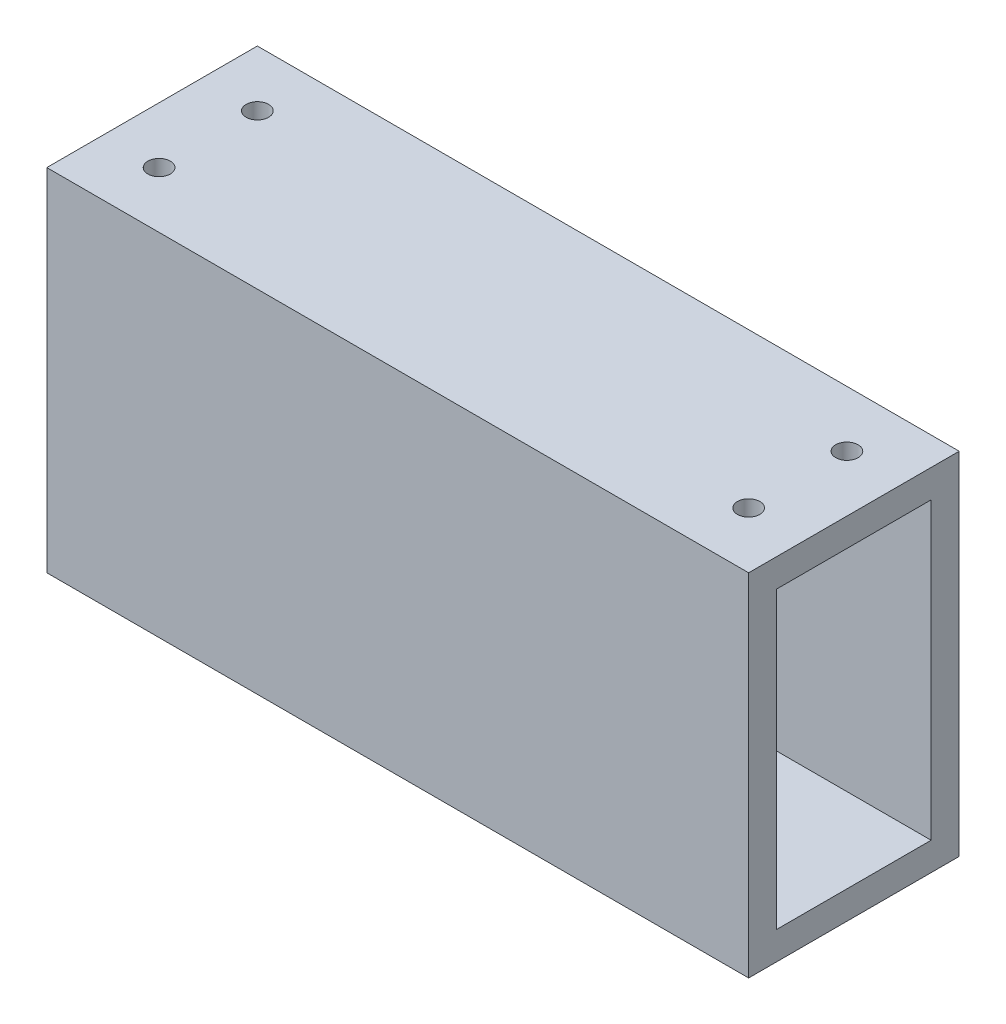
ISO-10303-21;
HEADER;
FILE_DESCRIPTION(('STEP AP214'),'2;1');
FILE_NAME('part.step','',(''),(''),'','','');
FILE_SCHEMA(('AUTOMOTIVE_DESIGN { 1 0 10303 214 1 1 1 1 }'));
ENDSEC;
DATA;
#1=APPLICATION_CONTEXT('core data for automotive mechanical design processes');
#2=APPLICATION_PROTOCOL_DEFINITION('international standard','automotive_design',2000,#1);
#3=PRODUCT_CONTEXT('',#1,'mechanical');
#4=PRODUCT('Part','Part','',(#3));
#5=PRODUCT_RELATED_PRODUCT_CATEGORY('part','',(#4));
#6=PRODUCT_DEFINITION_FORMATION('','',#4);
#7=PRODUCT_DEFINITION_CONTEXT('part definition',#1,'design');
#8=PRODUCT_DEFINITION('design','',#6,#7);
#9=PRODUCT_DEFINITION_SHAPE('','',#8);
#10=(LENGTH_UNIT() NAMED_UNIT(*) SI_UNIT(.MILLI.,.METRE.));
#11=(NAMED_UNIT(*) PLANE_ANGLE_UNIT() SI_UNIT($,.RADIAN.));
#12=(NAMED_UNIT(*) SI_UNIT($,.STERADIAN.) SOLID_ANGLE_UNIT());
#13=UNCERTAINTY_MEASURE_WITH_UNIT(LENGTH_MEASURE(1.E-05),#10,'distance_accuracy_value','');
#14=(GEOMETRIC_REPRESENTATION_CONTEXT(3) GLOBAL_UNCERTAINTY_ASSIGNED_CONTEXT((#13)) GLOBAL_UNIT_ASSIGNED_CONTEXT((#10,
#11,#12)) REPRESENTATION_CONTEXT('',''));
#15=CARTESIAN_POINT('',(0.,0.,0.));
#16=DIRECTION('',(0.,0.,1.));
#17=DIRECTION('',(1.,0.,0.));
#18=AXIS2_PLACEMENT_3D('',#15,#16,#17);
#19=CARTESIAN_POINT('',(50.,50.,-15.));
#20=DIRECTION('',(-1.,0.,0.));
#21=DIRECTION('',(0.,0.,1.));
#22=AXIS2_PLACEMENT_3D('',#19,#20,#21);
#23=PLANE('',#22);
#24=DIRECTION('',(0.,0.,-1.));
#25=VECTOR('',#24,1.);
#26=CARTESIAN_POINT('',(50.,46.,11.));
#27=LINE('',#26,#25);
#28=CARTESIAN_POINT('',(50.,46.,11.));
#29=VERTEX_POINT('',#28);
#30=CARTESIAN_POINT('',(50.,46.,-11.));
#31=VERTEX_POINT('',#30);
#32=EDGE_CURVE('E121',#29,#31,#27,.T.);
#33=ORIENTED_EDGE('',*,*,#32,.T.);
#34=DIRECTION('',(0.,-1.,0.));
#35=VECTOR('',#34,1.);
#36=CARTESIAN_POINT('',(50.,46.,-11.));
#37=LINE('',#36,#35);
#38=CARTESIAN_POINT('',(50.,4.,-11.));
#39=VERTEX_POINT('',#38);
#40=EDGE_CURVE('E114',#31,#39,#37,.T.);
#41=ORIENTED_EDGE('',*,*,#40,.T.);
#42=DIRECTION('',(0.,0.,1.));
#43=VECTOR('',#42,1.);
#44=CARTESIAN_POINT('',(50.,4.,-11.));
#45=LINE('',#44,#43);
#46=CARTESIAN_POINT('',(50.,4.00000000000001,11.));
#47=VERTEX_POINT('',#46);
#48=EDGE_CURVE('E124',#39,#47,#45,.T.);
#49=ORIENTED_EDGE('',*,*,#48,.T.);
#50=DIRECTION('',(0.,1.,0.));
#51=VECTOR('',#50,1.);
#52=CARTESIAN_POINT('',(50.,4.,11.));
#53=LINE('',#52,#51);
#54=EDGE_CURVE('E62',#47,#29,#53,.T.);
#55=ORIENTED_EDGE('',*,*,#54,.T.);
#56=EDGE_LOOP('',(#33,#41,#49,#55));
#57=FACE_BOUND('',#56,.T.);
#58=DIRECTION('',(0.,0.,-1.));
#59=VECTOR('',#58,1.);
#60=CARTESIAN_POINT('',(50.,0.,-15.));
#61=LINE('',#60,#59);
#62=CARTESIAN_POINT('',(50.,0.,15.));
#63=VERTEX_POINT('',#62);
#64=CARTESIAN_POINT('',(50.,0.,-15.));
#65=VERTEX_POINT('',#64);
#66=EDGE_CURVE('E158',#63,#65,#61,.T.);
#67=ORIENTED_EDGE('',*,*,#66,.T.);
#68=DIRECTION('',(0.,-1.,0.));
#69=VECTOR('',#68,1.);
#70=CARTESIAN_POINT('',(50.,50.,-15.));
#71=LINE('',#70,#69);
#72=CARTESIAN_POINT('',(50.,50.,-15.));
#73=VERTEX_POINT('',#72);
#74=EDGE_CURVE('E11',#73,#65,#71,.T.);
#75=ORIENTED_EDGE('',*,*,#74,.F.);
#76=DIRECTION('',(0.,0.,-1.));
#77=VECTOR('',#76,1.);
#78=CARTESIAN_POINT('',(50.,50.,-15.));
#79=LINE('',#78,#77);
#80=CARTESIAN_POINT('',(50.,50.,15.));
#81=VERTEX_POINT('',#80);
#82=EDGE_CURVE('E164',#81,#73,#79,.T.);
#83=ORIENTED_EDGE('',*,*,#82,.F.);
#84=DIRECTION('',(0.,-1.,0.));
#85=VECTOR('',#84,1.);
#86=CARTESIAN_POINT('',(50.,50.,15.));
#87=LINE('',#86,#85);
#88=EDGE_CURVE('E178',#81,#63,#87,.T.);
#89=ORIENTED_EDGE('',*,*,#88,.T.);
#90=EDGE_LOOP('',(#67,#75,#83,#89));
#91=FACE_BOUND('',#90,.T.);
#92=ADVANCED_FACE('F45',(#57,#91),#23,.F.);
#93=CARTESIAN_POINT('',(-50.,50.,-15.));
#94=DIRECTION('',(0.,0.,1.));
#95=DIRECTION('',(1.,0.,0.));
#96=AXIS2_PLACEMENT_3D('',#93,#94,#95);
#97=PLANE('',#96);
#98=DIRECTION('',(-1.,0.,0.));
#99=VECTOR('',#98,1.);
#100=CARTESIAN_POINT('',(-50.,0.,-15.));
#101=LINE('',#100,#99);
#102=CARTESIAN_POINT('',(-50.,0.,-15.));
#103=VERTEX_POINT('',#102);
#104=EDGE_CURVE('E182',#65,#103,#101,.T.);
#105=ORIENTED_EDGE('',*,*,#104,.T.);
#106=DIRECTION('',(0.,-1.,0.));
#107=VECTOR('',#106,1.);
#108=CARTESIAN_POINT('',(-50.,50.,-15.));
#109=LINE('',#108,#107);
#110=CARTESIAN_POINT('',(-50.,50.,-15.));
#111=VERTEX_POINT('',#110);
#112=EDGE_CURVE('E54',#111,#103,#109,.T.);
#113=ORIENTED_EDGE('',*,*,#112,.F.);
#114=DIRECTION('',(-1.,0.,0.));
#115=VECTOR('',#114,1.);
#116=CARTESIAN_POINT('',(-50.,50.,-15.));
#117=LINE('',#116,#115);
#118=EDGE_CURVE('E168',#73,#111,#117,.T.);
#119=ORIENTED_EDGE('',*,*,#118,.F.);
#120=ORIENTED_EDGE('',*,*,#74,.T.);
#121=EDGE_LOOP('',(#105,#113,#119,#120));
#122=FACE_BOUND('',#121,.T.);
#123=ADVANCED_FACE('F269',(#122),#97,.F.);
#124=CARTESIAN_POINT('',(-50.,50.,-15.));
#125=DIRECTION('',(1.,0.,0.));
#126=DIRECTION('',(0.,0.,-1.));
#127=AXIS2_PLACEMENT_3D('',#124,#125,#126);
#128=PLANE('',#127);
#129=DIRECTION('',(0.,0.,1.));
#130=VECTOR('',#129,1.);
#131=CARTESIAN_POINT('',(-50.,4.,-11.));
#132=LINE('',#131,#130);
#133=CARTESIAN_POINT('',(-50.,4.,-11.));
#134=VERTEX_POINT('',#133);
#135=CARTESIAN_POINT('',(-50.,4.,11.));
#136=VERTEX_POINT('',#135);
#137=EDGE_CURVE('E148',#134,#136,#132,.T.);
#138=ORIENTED_EDGE('',*,*,#137,.F.);
#139=DIRECTION('',(0.,-1.,0.));
#140=VECTOR('',#139,1.);
#141=CARTESIAN_POINT('',(-50.,46.,-11.));
#142=LINE('',#141,#140);
#143=CARTESIAN_POINT('',(-50.,46.,-11.));
#144=VERTEX_POINT('',#143);
#145=EDGE_CURVE('E70',#144,#134,#142,.T.);
#146=ORIENTED_EDGE('',*,*,#145,.F.);
#147=DIRECTION('',(0.,0.,-1.));
#148=VECTOR('',#147,1.);
#149=CARTESIAN_POINT('',(-50.,46.,11.));
#150=LINE('',#149,#148);
#151=CARTESIAN_POINT('',(-50.,46.,11.));
#152=VERTEX_POINT('',#151);
#153=EDGE_CURVE('E132',#152,#144,#150,.T.);
#154=ORIENTED_EDGE('',*,*,#153,.F.);
#155=DIRECTION('',(0.,1.,0.));
#156=VECTOR('',#155,1.);
#157=CARTESIAN_POINT('',(-50.,4.,11.));
#158=LINE('',#157,#156);
#159=EDGE_CURVE('E136',#136,#152,#158,.T.);
#160=ORIENTED_EDGE('',*,*,#159,.F.);
#161=EDGE_LOOP('',(#138,#146,#154,#160));
#162=FACE_BOUND('',#161,.T.);
#163=DIRECTION('',(0.,0.,1.));
#164=VECTOR('',#163,1.);
#165=CARTESIAN_POINT('',(-50.,0.,-15.));
#166=LINE('',#165,#164);
#167=CARTESIAN_POINT('',(-50.,0.,15.));
#168=VERTEX_POINT('',#167);
#169=EDGE_CURVE('E185',#103,#168,#166,.T.);
#170=ORIENTED_EDGE('',*,*,#169,.T.);
#171=DIRECTION('',(0.,-1.,0.));
#172=VECTOR('',#171,1.);
#173=CARTESIAN_POINT('',(-50.,50.,15.));
#174=LINE('',#173,#172);
#175=CARTESIAN_POINT('',(-50.,50.,15.));
#176=VERTEX_POINT('',#175);
#177=EDGE_CURVE('E193',#176,#168,#174,.T.);
#178=ORIENTED_EDGE('',*,*,#177,.F.);
#179=DIRECTION('',(0.,0.,1.));
#180=VECTOR('',#179,1.);
#181=CARTESIAN_POINT('',(-50.,50.,-15.));
#182=LINE('',#181,#180);
#183=EDGE_CURVE('E172',#111,#176,#182,.T.);
#184=ORIENTED_EDGE('',*,*,#183,.F.);
#185=ORIENTED_EDGE('',*,*,#112,.T.);
#186=EDGE_LOOP('',(#170,#178,#184,#185));
#187=FACE_BOUND('',#186,.T.);
#188=ADVANCED_FACE('F274',(#162,#187),#128,.F.);
#189=CARTESIAN_POINT('',(-50.,50.,15.));
#190=DIRECTION('',(0.,0.,-1.));
#191=DIRECTION('',(-1.,0.,0.));
#192=AXIS2_PLACEMENT_3D('',#189,#190,#191);
#193=PLANE('',#192);
#194=DIRECTION('',(1.,0.,0.));
#195=VECTOR('',#194,1.);
#196=CARTESIAN_POINT('',(-50.,0.,15.));
#197=LINE('',#196,#195);
#198=EDGE_CURVE('E169',#168,#63,#197,.T.);
#199=ORIENTED_EDGE('',*,*,#198,.T.);
#200=ORIENTED_EDGE('',*,*,#88,.F.);
#201=DIRECTION('',(1.,0.,0.));
#202=VECTOR('',#201,1.);
#203=CARTESIAN_POINT('',(-50.,50.,15.));
#204=LINE('',#203,#202);
#205=EDGE_CURVE('E175',#176,#81,#204,.T.);
#206=ORIENTED_EDGE('',*,*,#205,.F.);
#207=ORIENTED_EDGE('',*,*,#177,.T.);
#208=EDGE_LOOP('',(#199,#200,#206,#207));
#209=FACE_BOUND('',#208,.T.);
#210=ADVANCED_FACE('F257',(#209),#193,.F.);
#211=CARTESIAN_POINT('',(0.,50.,0.));
#212=DIRECTION('',(0.,1.,0.));
#213=DIRECTION('',(0.,0.,1.));
#214=AXIS2_PLACEMENT_3D('',#211,#212,#213);
#215=PLANE('',#214);
#216=CARTESIAN_POINT('',(-42.,50.,7.));
#217=DIRECTION('',(0.,1.,0.));
#218=DIRECTION('',(0.,0.,1.));
#219=AXIS2_PLACEMENT_3D('',#216,#217,#218);
#220=CIRCLE('',#219,1.6);
#221=CARTESIAN_POINT('',(-42.,50.,8.6));
#222=VERTEX_POINT('',#221);
#223=EDGE_CURVE('E237',#222,#222,#220,.T.);
#224=ORIENTED_EDGE('',*,*,#223,.F.);
#225=EDGE_LOOP('',(#224));
#226=FACE_BOUND('',#225,.T.);
#227=CARTESIAN_POINT('',(42.,50.,-7.));
#228=DIRECTION('',(0.,1.,0.));
#229=DIRECTION('',(0.,0.,1.));
#230=AXIS2_PLACEMENT_3D('',#227,#228,#229);
#231=CIRCLE('',#230,1.6);
#232=CARTESIAN_POINT('',(42.,50.,-5.4));
#233=VERTEX_POINT('',#232);
#234=EDGE_CURVE('E238',#233,#233,#231,.T.);
#235=ORIENTED_EDGE('',*,*,#234,.F.);
#236=EDGE_LOOP('',(#235));
#237=FACE_BOUND('',#236,.T.);
#238=CARTESIAN_POINT('',(42.,50.,7.));
#239=DIRECTION('',(0.,1.,0.));
#240=DIRECTION('',(0.,0.,1.));
#241=AXIS2_PLACEMENT_3D('',#238,#239,#240);
#242=CIRCLE('',#241,1.6);
#243=CARTESIAN_POINT('',(42.,50.,8.6));
#244=VERTEX_POINT('',#243);
#245=EDGE_CURVE('E242',#244,#244,#242,.T.);
#246=ORIENTED_EDGE('',*,*,#245,.F.);
#247=EDGE_LOOP('',(#246));
#248=FACE_BOUND('',#247,.T.);
#249=CARTESIAN_POINT('',(-42.,50.,-7.));
#250=DIRECTION('',(0.,1.,0.));
#251=DIRECTION('',(0.,0.,1.));
#252=AXIS2_PLACEMENT_3D('',#249,#250,#251);
#253=CIRCLE('',#252,1.6);
#254=CARTESIAN_POINT('',(-42.,50.,-5.4));
#255=VERTEX_POINT('',#254);
#256=EDGE_CURVE('E213',#255,#255,#253,.T.);
#257=ORIENTED_EDGE('',*,*,#256,.F.);
#258=EDGE_LOOP('',(#257));
#259=FACE_BOUND('',#258,.T.);
#260=ORIENTED_EDGE('',*,*,#82,.T.);
#261=ORIENTED_EDGE('',*,*,#118,.T.);
#262=ORIENTED_EDGE('',*,*,#183,.T.);
#263=ORIENTED_EDGE('',*,*,#205,.T.);
#264=EDGE_LOOP('',(#260,#261,#262,#263));
#265=FACE_BOUND('',#264,.T.);
#266=ADVANCED_FACE('F253',(#226,#237,#248,#259,#265),#215,.T.);
#267=CARTESIAN_POINT('',(0.,0.,0.));
#268=DIRECTION('',(0.,1.,0.));
#269=DIRECTION('',(0.,0.,1.));
#270=AXIS2_PLACEMENT_3D('',#267,#268,#269);
#271=PLANE('',#270);
#272=CARTESIAN_POINT('',(13.,0.,8.));
#273=DIRECTION('',(0.,-1.,0.));
#274=DIRECTION('',(0.,0.,-1.));
#275=AXIS2_PLACEMENT_3D('',#272,#273,#274);
#276=CIRCLE('',#275,2.1);
#277=CARTESIAN_POINT('',(13.,0.,5.9));
#278=VERTEX_POINT('',#277);
#279=EDGE_CURVE('E204',#278,#278,#276,.T.);
#280=ORIENTED_EDGE('',*,*,#279,.F.);
#281=EDGE_LOOP('',(#280));
#282=FACE_BOUND('',#281,.T.);
#283=CARTESIAN_POINT('',(-13.,0.,8.));
#284=DIRECTION('',(0.,-1.,0.));
#285=DIRECTION('',(0.,0.,1.));
#286=AXIS2_PLACEMENT_3D('',#283,#284,#285);
#287=CIRCLE('',#286,2.1);
#288=CARTESIAN_POINT('',(-13.,0.,10.1));
#289=VERTEX_POINT('',#288);
#290=EDGE_CURVE('E139',#289,#289,#287,.T.);
#291=ORIENTED_EDGE('',*,*,#290,.F.);
#292=EDGE_LOOP('',(#291));
#293=FACE_BOUND('',#292,.T.);
#294=ORIENTED_EDGE('',*,*,#66,.F.);
#295=ORIENTED_EDGE('',*,*,#198,.F.);
#296=ORIENTED_EDGE('',*,*,#169,.F.);
#297=ORIENTED_EDGE('',*,*,#104,.F.);
#298=EDGE_LOOP('',(#294,#295,#296,#297));
#299=FACE_BOUND('',#298,.T.);
#300=ADVANCED_FACE('F256',(#282,#293,#299),#271,.F.);
#301=CARTESIAN_POINT('',(50.,46.,-11.));
#302=DIRECTION('',(0.,0.,-1.));
#303=DIRECTION('',(-1.,0.,0.));
#304=AXIS2_PLACEMENT_3D('',#301,#302,#303);
#305=PLANE('',#304);
#306=ORIENTED_EDGE('',*,*,#145,.T.);
#307=DIRECTION('',(-1.,0.,0.));
#308=VECTOR('',#307,1.);
#309=CARTESIAN_POINT('',(50.,4.,-11.));
#310=LINE('',#309,#308);
#311=EDGE_CURVE('E110',#39,#134,#310,.T.);
#312=ORIENTED_EDGE('',*,*,#311,.F.);
#313=ORIENTED_EDGE('',*,*,#40,.F.);
#314=DIRECTION('',(-1.,0.,0.));
#315=VECTOR('',#314,1.);
#316=CARTESIAN_POINT('',(50.,46.,-11.));
#317=LINE('',#316,#315);
#318=EDGE_CURVE('E155',#31,#144,#317,.T.);
#319=ORIENTED_EDGE('',*,*,#318,.T.);
#320=EDGE_LOOP('',(#306,#312,#313,#319));
#321=FACE_BOUND('',#320,.T.);
#322=ADVANCED_FACE('F112',(#321),#305,.F.);
#323=CARTESIAN_POINT('',(50.,46.,11.));
#324=DIRECTION('',(0.,1.,0.));
#325=DIRECTION('',(0.,0.,1.));
#326=AXIS2_PLACEMENT_3D('',#323,#324,#325);
#327=PLANE('',#326);
#328=CARTESIAN_POINT('',(-42.,46.,7.));
#329=DIRECTION('',(0.,1.,0.));
#330=DIRECTION('',(0.,0.,1.));
#331=AXIS2_PLACEMENT_3D('',#328,#329,#330);
#332=CIRCLE('',#331,1.6);
#333=CARTESIAN_POINT('',(-42.,46.,8.6));
#334=VERTEX_POINT('',#333);
#335=EDGE_CURVE('E48',#334,#334,#332,.T.);
#336=ORIENTED_EDGE('',*,*,#335,.T.);
#337=EDGE_LOOP('',(#336));
#338=FACE_BOUND('',#337,.T.);
#339=CARTESIAN_POINT('',(42.,46.,-7.));
#340=DIRECTION('',(0.,1.,0.));
#341=DIRECTION('',(0.,0.,1.));
#342=AXIS2_PLACEMENT_3D('',#339,#340,#341);
#343=CIRCLE('',#342,1.6);
#344=CARTESIAN_POINT('',(42.,46.,-5.4));
#345=VERTEX_POINT('',#344);
#346=EDGE_CURVE('E216',#345,#345,#343,.T.);
#347=ORIENTED_EDGE('',*,*,#346,.T.);
#348=EDGE_LOOP('',(#347));
#349=FACE_BOUND('',#348,.T.);
#350=CARTESIAN_POINT('',(42.,46.,7.));
#351=DIRECTION('',(0.,1.,0.));
#352=DIRECTION('',(0.,0.,1.));
#353=AXIS2_PLACEMENT_3D('',#350,#351,#352);
#354=CIRCLE('',#353,1.6);
#355=CARTESIAN_POINT('',(42.,46.,8.6));
#356=VERTEX_POINT('',#355);
#357=EDGE_CURVE('E212',#356,#356,#354,.T.);
#358=ORIENTED_EDGE('',*,*,#357,.T.);
#359=EDGE_LOOP('',(#358));
#360=FACE_BOUND('',#359,.T.);
#361=CARTESIAN_POINT('',(-42.,46.,-7.));
#362=DIRECTION('',(0.,1.,0.));
#363=DIRECTION('',(0.,0.,1.));
#364=AXIS2_PLACEMENT_3D('',#361,#362,#363);
#365=CIRCLE('',#364,1.6);
#366=CARTESIAN_POINT('',(-42.,46.,-5.4));
#367=VERTEX_POINT('',#366);
#368=EDGE_CURVE('E208',#367,#367,#365,.T.);
#369=ORIENTED_EDGE('',*,*,#368,.T.);
#370=EDGE_LOOP('',(#369));
#371=FACE_BOUND('',#370,.T.);
#372=ORIENTED_EDGE('',*,*,#153,.T.);
#373=ORIENTED_EDGE('',*,*,#318,.F.);
#374=ORIENTED_EDGE('',*,*,#32,.F.);
#375=DIRECTION('',(-1.,0.,0.));
#376=VECTOR('',#375,1.);
#377=CARTESIAN_POINT('',(50.,46.,11.));
#378=LINE('',#377,#376);
#379=EDGE_CURVE('E159',#29,#152,#378,.T.);
#380=ORIENTED_EDGE('',*,*,#379,.T.);
#381=EDGE_LOOP('',(#372,#373,#374,#380));
#382=FACE_BOUND('',#381,.T.);
#383=ADVANCED_FACE('F286',(#338,#349,#360,#371,#382),#327,.F.);
#384=CARTESIAN_POINT('',(50.,4.,11.));
#385=DIRECTION('',(0.,0.,1.));
#386=DIRECTION('',(1.,0.,0.));
#387=AXIS2_PLACEMENT_3D('',#384,#385,#386);
#388=PLANE('',#387);
#389=ORIENTED_EDGE('',*,*,#159,.T.);
#390=ORIENTED_EDGE('',*,*,#379,.F.);
#391=ORIENTED_EDGE('',*,*,#54,.F.);
#392=DIRECTION('',(-1.,0.,0.));
#393=VECTOR('',#392,1.);
#394=CARTESIAN_POINT('',(50.,4.,11.));
#395=LINE('',#394,#393);
#396=EDGE_CURVE('E120',#47,#136,#395,.T.);
#397=ORIENTED_EDGE('',*,*,#396,.T.);
#398=EDGE_LOOP('',(#389,#390,#391,#397));
#399=FACE_BOUND('',#398,.T.);
#400=ADVANCED_FACE('F333',(#399),#388,.F.);
#401=CARTESIAN_POINT('',(50.,4.,-11.));
#402=DIRECTION('',(0.,-1.,0.));
#403=DIRECTION('',(0.,0.,-1.));
#404=AXIS2_PLACEMENT_3D('',#401,#402,#403);
#405=PLANE('',#404);
#406=CARTESIAN_POINT('',(13.,4.,8.));
#407=DIRECTION('',(0.,-1.,0.));
#408=DIRECTION('',(0.,0.,-1.));
#409=AXIS2_PLACEMENT_3D('',#406,#407,#408);
#410=CIRCLE('',#409,2.1);
#411=CARTESIAN_POINT('',(13.,4.,5.9));
#412=VERTEX_POINT('',#411);
#413=EDGE_CURVE('E149',#412,#412,#410,.T.);
#414=ORIENTED_EDGE('',*,*,#413,.T.);
#415=EDGE_LOOP('',(#414));
#416=FACE_BOUND('',#415,.T.);
#417=CARTESIAN_POINT('',(-13.,4.,8.));
#418=DIRECTION('',(0.,-1.,0.));
#419=DIRECTION('',(0.,0.,-1.));
#420=AXIS2_PLACEMENT_3D('',#417,#418,#419);
#421=CIRCLE('',#420,2.1);
#422=CARTESIAN_POINT('',(-13.,4.,5.9));
#423=VERTEX_POINT('',#422);
#424=EDGE_CURVE('E200',#423,#423,#421,.T.);
#425=ORIENTED_EDGE('',*,*,#424,.T.);
#426=EDGE_LOOP('',(#425));
#427=FACE_BOUND('',#426,.T.);
#428=ORIENTED_EDGE('',*,*,#137,.T.);
#429=ORIENTED_EDGE('',*,*,#396,.F.);
#430=ORIENTED_EDGE('',*,*,#48,.F.);
#431=ORIENTED_EDGE('',*,*,#311,.T.);
#432=EDGE_LOOP('',(#428,#429,#430,#431));
#433=FACE_BOUND('',#432,.T.);
#434=ADVANCED_FACE('F125',(#416,#427,#433),#405,.F.);
#435=CARTESIAN_POINT('',(-13.,20.,8.));
#436=DIRECTION('',(0.,-1.,0.));
#437=DIRECTION('',(0.,0.,-1.));
#438=AXIS2_PLACEMENT_3D('',#435,#436,#437);
#439=CYLINDRICAL_SURFACE('',#438,2.1);
#440=ORIENTED_EDGE('',*,*,#290,.T.);
#441=EDGE_LOOP('',(#440));
#442=FACE_BOUND('',#441,.T.);
#443=ORIENTED_EDGE('',*,*,#424,.F.);
#444=EDGE_LOOP('',(#443));
#445=FACE_BOUND('',#444,.T.);
#446=ADVANCED_FACE('F349',(#442,#445),#439,.F.);
#447=CARTESIAN_POINT('',(13.,20.,8.));
#448=DIRECTION('',(0.,-1.,0.));
#449=DIRECTION('',(0.,0.,-1.));
#450=AXIS2_PLACEMENT_3D('',#447,#448,#449);
#451=CYLINDRICAL_SURFACE('',#450,2.1);
#452=ORIENTED_EDGE('',*,*,#279,.T.);
#453=EDGE_LOOP('',(#452));
#454=FACE_BOUND('',#453,.T.);
#455=ORIENTED_EDGE('',*,*,#413,.F.);
#456=EDGE_LOOP('',(#455));
#457=FACE_BOUND('',#456,.T.);
#458=ADVANCED_FACE('F359',(#454,#457),#451,.F.);
#459=CARTESIAN_POINT('',(-42.,30.,-7.));
#460=DIRECTION('',(0.,1.,0.));
#461=DIRECTION('',(0.,0.,1.));
#462=AXIS2_PLACEMENT_3D('',#459,#460,#461);
#463=CYLINDRICAL_SURFACE('',#462,1.6);
#464=ORIENTED_EDGE('',*,*,#256,.T.);
#465=EDGE_LOOP('',(#464));
#466=FACE_BOUND('',#465,.T.);
#467=ORIENTED_EDGE('',*,*,#368,.F.);
#468=EDGE_LOOP('',(#467));
#469=FACE_BOUND('',#468,.T.);
#470=ADVANCED_FACE('F367',(#466,#469),#463,.F.);
#471=CARTESIAN_POINT('',(42.,30.,7.));
#472=DIRECTION('',(0.,1.,0.));
#473=DIRECTION('',(0.,0.,1.));
#474=AXIS2_PLACEMENT_3D('',#471,#472,#473);
#475=CYLINDRICAL_SURFACE('',#474,1.6);
#476=ORIENTED_EDGE('',*,*,#245,.T.);
#477=EDGE_LOOP('',(#476));
#478=FACE_BOUND('',#477,.T.);
#479=ORIENTED_EDGE('',*,*,#357,.F.);
#480=EDGE_LOOP('',(#479));
#481=FACE_BOUND('',#480,.T.);
#482=ADVANCED_FACE('F250',(#478,#481),#475,.F.);
#483=CARTESIAN_POINT('',(42.,30.,-7.));
#484=DIRECTION('',(0.,1.,0.));
#485=DIRECTION('',(0.,0.,1.));
#486=AXIS2_PLACEMENT_3D('',#483,#484,#485);
#487=CYLINDRICAL_SURFACE('',#486,1.6);
#488=ORIENTED_EDGE('',*,*,#234,.T.);
#489=EDGE_LOOP('',(#488));
#490=FACE_BOUND('',#489,.T.);
#491=ORIENTED_EDGE('',*,*,#346,.F.);
#492=EDGE_LOOP('',(#491));
#493=FACE_BOUND('',#492,.T.);
#494=ADVANCED_FACE('F384',(#490,#493),#487,.F.);
#495=CARTESIAN_POINT('',(-42.,30.,7.));
#496=DIRECTION('',(0.,1.,0.));
#497=DIRECTION('',(0.,0.,1.));
#498=AXIS2_PLACEMENT_3D('',#495,#496,#497);
#499=CYLINDRICAL_SURFACE('',#498,1.6);
#500=ORIENTED_EDGE('',*,*,#223,.T.);
#501=EDGE_LOOP('',(#500));
#502=FACE_BOUND('',#501,.T.);
#503=ORIENTED_EDGE('',*,*,#335,.F.);
#504=EDGE_LOOP('',(#503));
#505=FACE_BOUND('',#504,.T.);
#506=ADVANCED_FACE('F393',(#502,#505),#499,.F.);
#507=CLOSED_SHELL('',(#92,#123,#188,#210,#266,#300,#322,#383,#400,#434,#446,#458,#470,#482,#494,#506));
#508=MANIFOLD_SOLID_BREP('B2',#507);
#509=ADVANCED_BREP_SHAPE_REPRESENTATION('',(#18,#508),#14);
#510=SHAPE_DEFINITION_REPRESENTATION(#9,#509);
ENDSEC;
END-ISO-10303-21;
